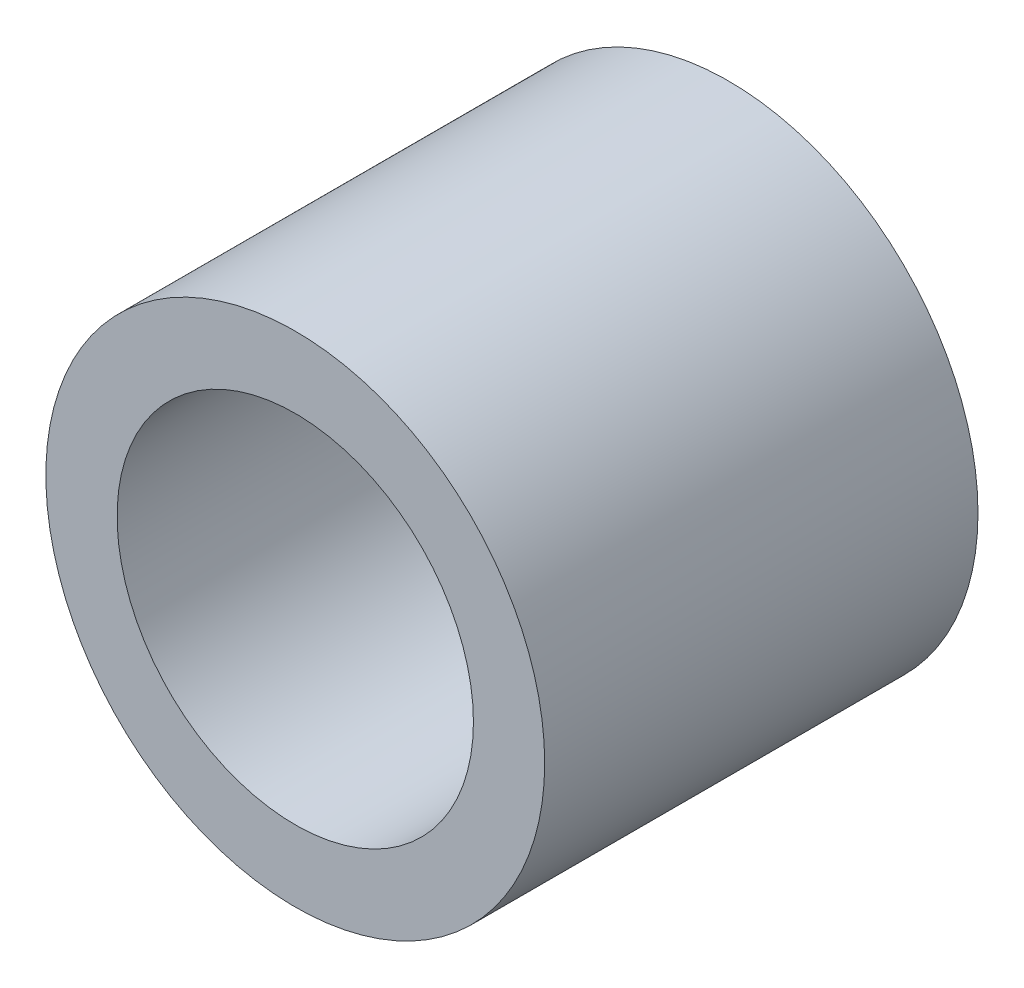
ISO-10303-21;
HEADER;
FILE_DESCRIPTION(('STEP AP214'),'2;1');
FILE_NAME('part.step','',(''),(''),'','','');
FILE_SCHEMA(('AUTOMOTIVE_DESIGN { 1 0 10303 214 1 1 1 1 }'));
ENDSEC;
DATA;
#1=APPLICATION_CONTEXT('core data for automotive mechanical design processes');
#2=APPLICATION_PROTOCOL_DEFINITION('international standard','automotive_design',2000,#1);
#3=PRODUCT_CONTEXT('',#1,'mechanical');
#4=PRODUCT('Part','Part','',(#3));
#5=PRODUCT_RELATED_PRODUCT_CATEGORY('part','',(#4));
#6=PRODUCT_DEFINITION_FORMATION('','',#4);
#7=PRODUCT_DEFINITION_CONTEXT('part definition',#1,'design');
#8=PRODUCT_DEFINITION('design','',#6,#7);
#9=PRODUCT_DEFINITION_SHAPE('','',#8);
#10=(LENGTH_UNIT() NAMED_UNIT(*) SI_UNIT(.MILLI.,.METRE.));
#11=(NAMED_UNIT(*) PLANE_ANGLE_UNIT() SI_UNIT($,.RADIAN.));
#12=(NAMED_UNIT(*) SI_UNIT($,.STERADIAN.) SOLID_ANGLE_UNIT());
#13=UNCERTAINTY_MEASURE_WITH_UNIT(LENGTH_MEASURE(1.E-05),#10,'distance_accuracy_value','');
#14=(GEOMETRIC_REPRESENTATION_CONTEXT(3) GLOBAL_UNCERTAINTY_ASSIGNED_CONTEXT((#13)) GLOBAL_UNIT_ASSIGNED_CONTEXT((#10,
#11,#12)) REPRESENTATION_CONTEXT('',''));
#15=CARTESIAN_POINT('',(0.,0.,0.));
#16=DIRECTION('',(0.,0.,1.));
#17=DIRECTION('',(1.,0.,0.));
#18=AXIS2_PLACEMENT_3D('',#15,#16,#17);
#19=CARTESIAN_POINT('',(0.,0.,19.304));
#20=DIRECTION('',(0.,0.,1.));
#21=DIRECTION('',(1.,0.,0.));
#22=AXIS2_PLACEMENT_3D('',#19,#20,#21);
#23=PLANE('',#22);
#24=CARTESIAN_POINT('',(0.,0.,19.304));
#25=DIRECTION('',(0.,0.,1.));
#26=DIRECTION('',(1.,0.,0.));
#27=AXIS2_PLACEMENT_3D('',#24,#25,#26);
#28=CIRCLE('',#27,11.1125);
#29=CARTESIAN_POINT('',(11.1125,0.,19.304));
#30=VERTEX_POINT('',#29);
#31=EDGE_CURVE('E10',#30,#30,#28,.T.);
#32=ORIENTED_EDGE('',*,*,#31,.T.);
#33=EDGE_LOOP('',(#32));
#34=FACE_BOUND('',#33,.T.);
#35=CARTESIAN_POINT('',(0.,0.,19.304));
#36=DIRECTION('',(0.,0.,1.));
#37=DIRECTION('',(1.,0.,0.));
#38=AXIS2_PLACEMENT_3D('',#35,#36,#37);
#39=CIRCLE('',#38,7.9375);
#40=CARTESIAN_POINT('',(7.9375,0.,19.304));
#41=VERTEX_POINT('',#40);
#42=EDGE_CURVE('E56',#41,#41,#39,.T.);
#43=ORIENTED_EDGE('',*,*,#42,.F.);
#44=EDGE_LOOP('',(#43));
#45=FACE_BOUND('',#44,.T.);
#46=ADVANCED_FACE('F43',(#34,#45),#23,.T.);
#47=CARTESIAN_POINT('',(0.,0.,0.));
#48=DIRECTION('',(0.,0.,1.));
#49=DIRECTION('',(1.,0.,0.));
#50=AXIS2_PLACEMENT_3D('',#47,#48,#49);
#51=PLANE('',#50);
#52=CARTESIAN_POINT('',(0.,0.,0.));
#53=DIRECTION('',(0.,0.,1.));
#54=DIRECTION('',(1.,0.,0.));
#55=AXIS2_PLACEMENT_3D('',#52,#53,#54);
#56=CIRCLE('',#55,11.1125);
#57=CARTESIAN_POINT('',(11.1125,0.,0.));
#58=VERTEX_POINT('',#57);
#59=EDGE_CURVE('E47',#58,#58,#56,.T.);
#60=ORIENTED_EDGE('',*,*,#59,.F.);
#61=EDGE_LOOP('',(#60));
#62=FACE_BOUND('',#61,.T.);
#63=CARTESIAN_POINT('',(0.,0.,0.));
#64=DIRECTION('',(0.,0.,1.));
#65=DIRECTION('',(1.,0.,0.));
#66=AXIS2_PLACEMENT_3D('',#63,#64,#65);
#67=CIRCLE('',#66,7.9375);
#68=CARTESIAN_POINT('',(7.9375,0.,0.));
#69=VERTEX_POINT('',#68);
#70=EDGE_CURVE('E58',#69,#69,#67,.T.);
#71=ORIENTED_EDGE('',*,*,#70,.T.);
#72=EDGE_LOOP('',(#71));
#73=FACE_BOUND('',#72,.T.);
#74=ADVANCED_FACE('F70',(#62,#73),#51,.F.);
#75=CARTESIAN_POINT('',(0.,0.,19.304));
#76=DIRECTION('',(0.,0.,-1.));
#77=DIRECTION('',(-1.,0.,0.));
#78=AXIS2_PLACEMENT_3D('',#75,#76,#77);
#79=CYLINDRICAL_SURFACE('',#78,11.1125);
#80=ORIENTED_EDGE('',*,*,#31,.F.);
#81=EDGE_LOOP('',(#80));
#82=FACE_BOUND('',#81,.T.);
#83=ORIENTED_EDGE('',*,*,#59,.T.);
#84=EDGE_LOOP('',(#83));
#85=FACE_BOUND('',#84,.T.);
#86=ADVANCED_FACE('F45',(#82,#85),#79,.T.);
#87=CARTESIAN_POINT('',(0.,0.,19.304));
#88=DIRECTION('',(0.,0.,-1.));
#89=DIRECTION('',(-1.,0.,0.));
#90=AXIS2_PLACEMENT_3D('',#87,#88,#89);
#91=CYLINDRICAL_SURFACE('',#90,7.9375);
#92=ORIENTED_EDGE('',*,*,#42,.T.);
#93=EDGE_LOOP('',(#92));
#94=FACE_BOUND('',#93,.T.);
#95=ORIENTED_EDGE('',*,*,#70,.F.);
#96=EDGE_LOOP('',(#95));
#97=FACE_BOUND('',#96,.T.);
#98=ADVANCED_FACE('F66',(#94,#97),#91,.F.);
#99=CLOSED_SHELL('',(#46,#74,#86,#98));
#100=MANIFOLD_SOLID_BREP('B2',#99);
#101=ADVANCED_BREP_SHAPE_REPRESENTATION('',(#18,#100),#14);
#102=SHAPE_DEFINITION_REPRESENTATION(#9,#101);
ENDSEC;
END-ISO-10303-21;
